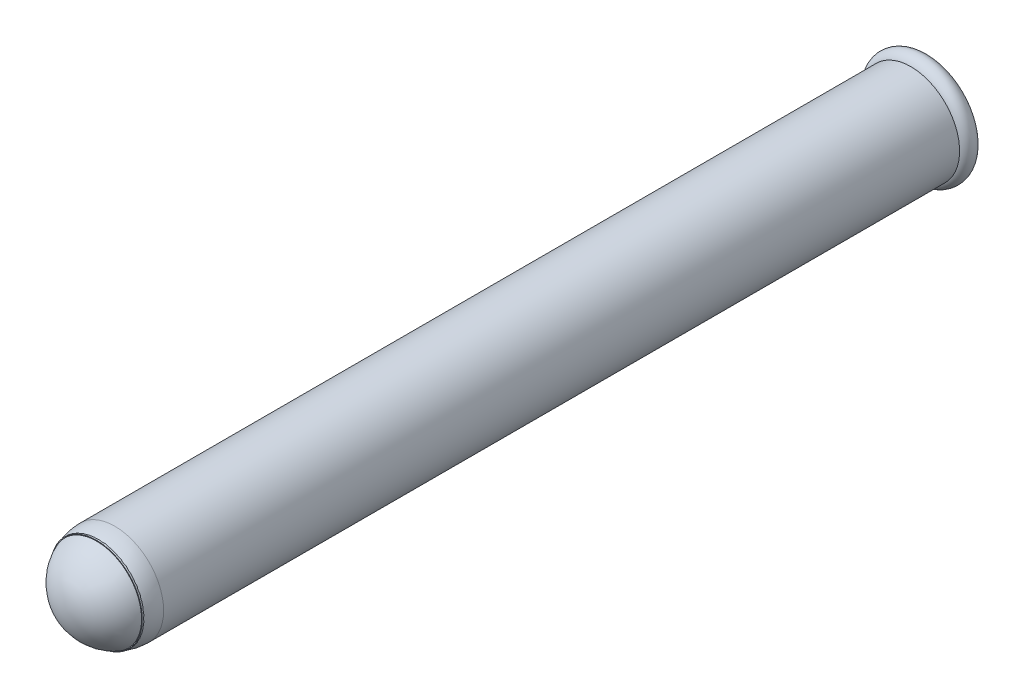
ISO-10303-21;
HEADER;
FILE_DESCRIPTION(('STEP AP214'),'2;1');
FILE_NAME('part.step','',(''),(''),'','','');
FILE_SCHEMA(('AUTOMOTIVE_DESIGN { 1 0 10303 214 1 1 1 1 }'));
ENDSEC;
DATA;
#1=APPLICATION_CONTEXT('core data for automotive mechanical design processes');
#2=APPLICATION_PROTOCOL_DEFINITION('international standard','automotive_design',2000,#1);
#3=PRODUCT_CONTEXT('',#1,'mechanical');
#4=PRODUCT('Part','Part','',(#3));
#5=PRODUCT_RELATED_PRODUCT_CATEGORY('part','',(#4));
#6=PRODUCT_DEFINITION_FORMATION('','',#4);
#7=PRODUCT_DEFINITION_CONTEXT('part definition',#1,'design');
#8=PRODUCT_DEFINITION('design','',#6,#7);
#9=PRODUCT_DEFINITION_SHAPE('','',#8);
#10=(LENGTH_UNIT() NAMED_UNIT(*) SI_UNIT(.MILLI.,.METRE.));
#11=(NAMED_UNIT(*) PLANE_ANGLE_UNIT() SI_UNIT($,.RADIAN.));
#12=(NAMED_UNIT(*) SI_UNIT($,.STERADIAN.) SOLID_ANGLE_UNIT());
#13=UNCERTAINTY_MEASURE_WITH_UNIT(LENGTH_MEASURE(1.E-05),#10,'distance_accuracy_value','');
#14=(GEOMETRIC_REPRESENTATION_CONTEXT(3) GLOBAL_UNCERTAINTY_ASSIGNED_CONTEXT((#13)) GLOBAL_UNIT_ASSIGNED_CONTEXT((#10,
#11,#12)) REPRESENTATION_CONTEXT('',''));
#15=CARTESIAN_POINT('',(0.,0.,0.));
#16=DIRECTION('',(0.,0.,1.));
#17=DIRECTION('',(1.,0.,0.));
#18=AXIS2_PLACEMENT_3D('',#15,#16,#17);
#19=CARTESIAN_POINT('',(0.,0.,140.));
#20=DIRECTION('',(0.,0.,-1.));
#21=DIRECTION('',(-1.,0.,0.));
#22=AXIS2_PLACEMENT_3D('',#19,#20,#21);
#23=CYLINDRICAL_SURFACE('',#22,8.);
#24=CARTESIAN_POINT('',(0.,0.,132.));
#25=DIRECTION('',(0.,0.,-1.));
#26=DIRECTION('',(-1.,0.,0.));
#27=AXIS2_PLACEMENT_3D('',#24,#25,#26);
#28=CIRCLE('',#27,8.);
#29=CARTESIAN_POINT('',(-8.,0.,132.));
#30=VERTEX_POINT('',#29);
#31=EDGE_CURVE('E12',#30,#30,#28,.T.);
#32=ORIENTED_EDGE('',*,*,#31,.T.);
#33=EDGE_LOOP('',(#32));
#34=FACE_BOUND('',#33,.T.);
#35=CARTESIAN_POINT('',(0.,0.,1.41421356237309));
#36=DIRECTION('',(0.,0.,-1.));
#37=DIRECTION('',(-1.,0.,0.));
#38=AXIS2_PLACEMENT_3D('',#35,#36,#37);
#39=CIRCLE('',#38,8.);
#40=CARTESIAN_POINT('',(-8.,0.,1.41421356237309));
#41=VERTEX_POINT('',#40);
#42=EDGE_CURVE('E58',#41,#41,#39,.F.);
#43=ORIENTED_EDGE('',*,*,#42,.T.);
#44=EDGE_LOOP('',(#43));
#45=FACE_BOUND('',#44,.T.);
#46=ADVANCED_FACE('F39',(#34,#45),#23,.T.);
#47=CARTESIAN_POINT('',(0.,0.,0.));
#48=DIRECTION('',(0.,0.,-1.));
#49=DIRECTION('',(-1.,0.,0.));
#50=AXIS2_PLACEMENT_3D('',#47,#48,#49);
#51=TOROIDAL_SURFACE('',#50,7.5,1.5);
#52=ORIENTED_EDGE('',*,*,#42,.F.);
#53=CARTESIAN_POINT('',(-7.5,0.,0.));
#54=DIRECTION('',(0.,1.,0.));
#55=DIRECTION('',(0.,0.,1.));
#56=AXIS2_PLACEMENT_3D('',#53,#54,#55);
#57=CIRCLE('',#56,1.5);
#58=CARTESIAN_POINT('',(-7.5,0.,1.5));
#59=VERTEX_POINT('',#58);
#60=EDGE_CURVE('E54',#59,#41,#57,.T.);
#61=ORIENTED_EDGE('',*,*,#60,.F.);
#62=CARTESIAN_POINT('',(0.,0.,1.5));
#63=DIRECTION('',(0.,0.,-1.));
#64=DIRECTION('',(-1.,0.,0.));
#65=AXIS2_PLACEMENT_3D('',#62,#63,#64);
#66=CIRCLE('',#65,7.5);
#67=EDGE_CURVE('E47',#59,#59,#66,.T.);
#68=ORIENTED_EDGE('',*,*,#67,.F.);
#69=ORIENTED_EDGE('',*,*,#60,.T.);
#70=EDGE_LOOP('',(#52,#61,#68,#69));
#71=FACE_BOUND('',#70,.T.);
#72=ADVANCED_FACE('F55',(#71),#51,.T.);
#73=CARTESIAN_POINT('',(0.,0.,135.));
#74=DIRECTION('',(0.,0.,-1.));
#75=DIRECTION('',(-1.,0.,0.));
#76=AXIS2_PLACEMENT_3D('',#73,#74,#75);
#77=PLANE('',#76);
#78=CARTESIAN_POINT('',(0.,0.,135.));
#79=DIRECTION('',(0.,0.,-1.));
#80=DIRECTION('',(-1.,0.,0.));
#81=AXIS2_PLACEMENT_3D('',#78,#79,#80);
#82=CIRCLE('',#81,7.5);
#83=CARTESIAN_POINT('',(-7.5,0.,135.));
#84=VERTEX_POINT('',#83);
#85=EDGE_CURVE('E60',#84,#84,#82,.T.);
#86=ORIENTED_EDGE('',*,*,#85,.T.);
#87=EDGE_LOOP('',(#86));
#88=FACE_BOUND('',#87,.T.);
#89=ADVANCED_FACE('F68',(#88),#77,.T.);
#90=CARTESIAN_POINT('',(0.,0.,135.));
#91=DIRECTION('',(0.,0.,-1.));
#92=DIRECTION('',(-1.,0.,0.));
#93=AXIS2_PLACEMENT_3D('',#90,#91,#92);
#94=CYLINDRICAL_SURFACE('',#93,7.5);
#95=ORIENTED_EDGE('',*,*,#67,.T.);
#96=EDGE_LOOP('',(#95));
#97=FACE_BOUND('',#96,.T.);
#98=ORIENTED_EDGE('',*,*,#85,.F.);
#99=EDGE_LOOP('',(#98));
#100=FACE_BOUND('',#99,.T.);
#101=ADVANCED_FACE('F65',(#97,#100),#94,.F.);
#102=CARTESIAN_POINT('',(0.,0.,132.));
#103=DIRECTION('',(0.,0.,1.));
#104=DIRECTION('',(1.,0.,0.));
#105=AXIS2_PLACEMENT_3D('',#102,#103,#104);
#106=SPHERICAL_SURFACE('',#105,8.);
#107=ORIENTED_EDGE('',*,*,#31,.F.);
#108=EDGE_LOOP('',(#107));
#109=FACE_BOUND('',#108,.T.);
#110=ADVANCED_FACE('F41',(#109),#106,.T.);
#111=CLOSED_SHELL('',(#46,#72,#89,#101,#110));
#112=MANIFOLD_SOLID_BREP('B2',#111);
#113=ADVANCED_BREP_SHAPE_REPRESENTATION('',(#18,#112),#14);
#114=SHAPE_DEFINITION_REPRESENTATION(#9,#113);
ENDSEC;
END-ISO-10303-21;
